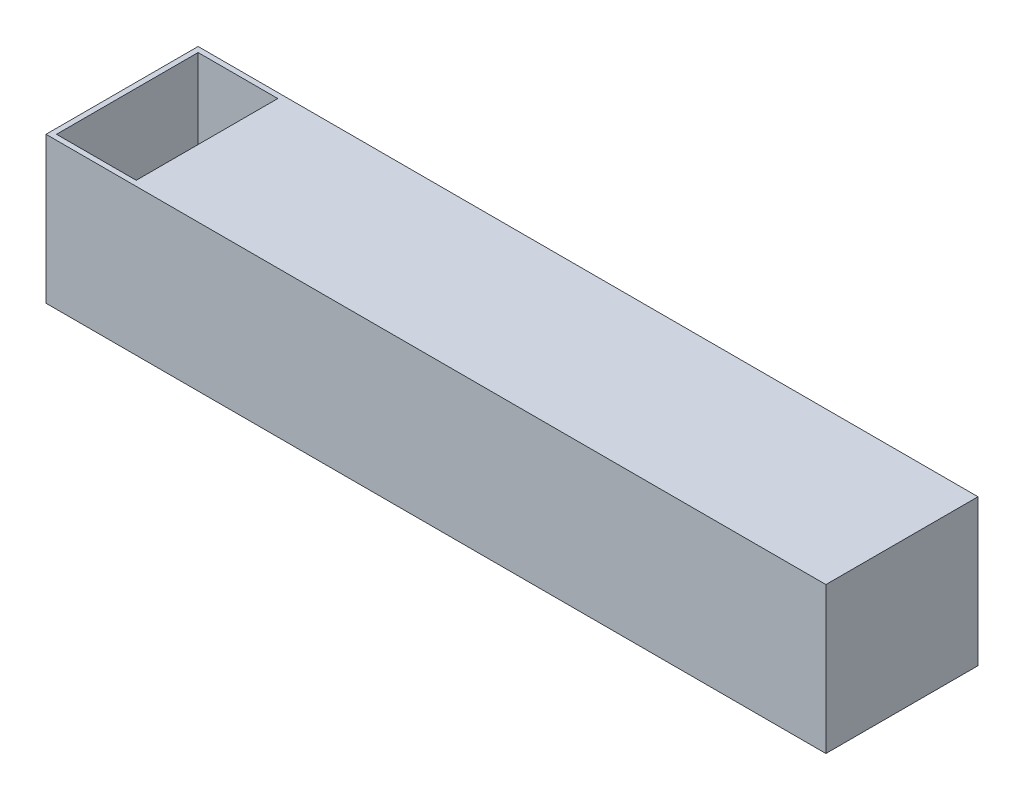
ISO-10303-21;
HEADER;
FILE_DESCRIPTION(('STEP AP214'),'2;1');
FILE_NAME('part.step','',(''),(''),'','','');
FILE_SCHEMA(('AUTOMOTIVE_DESIGN { 1 0 10303 214 1 1 1 1 }'));
ENDSEC;
DATA;
#1=APPLICATION_CONTEXT('core data for automotive mechanical design processes');
#2=APPLICATION_PROTOCOL_DEFINITION('international standard','automotive_design',2000,#1);
#3=PRODUCT_CONTEXT('',#1,'mechanical');
#4=PRODUCT('Part','Part','',(#3));
#5=PRODUCT_RELATED_PRODUCT_CATEGORY('part','',(#4));
#6=PRODUCT_DEFINITION_FORMATION('','',#4);
#7=PRODUCT_DEFINITION_CONTEXT('part definition',#1,'design');
#8=PRODUCT_DEFINITION('design','',#6,#7);
#9=PRODUCT_DEFINITION_SHAPE('','',#8);
#10=(LENGTH_UNIT() NAMED_UNIT(*) SI_UNIT(.MILLI.,.METRE.));
#11=(NAMED_UNIT(*) PLANE_ANGLE_UNIT() SI_UNIT($,.RADIAN.));
#12=(NAMED_UNIT(*) SI_UNIT($,.STERADIAN.) SOLID_ANGLE_UNIT());
#13=UNCERTAINTY_MEASURE_WITH_UNIT(LENGTH_MEASURE(1.E-05),#10,'distance_accuracy_value','');
#14=(GEOMETRIC_REPRESENTATION_CONTEXT(3) GLOBAL_UNCERTAINTY_ASSIGNED_CONTEXT((#13)) GLOBAL_UNIT_ASSIGNED_CONTEXT((#10,
#11,#12)) REPRESENTATION_CONTEXT('',''));
#15=CARTESIAN_POINT('',(0.,0.,0.));
#16=DIRECTION('',(0.,0.,1.));
#17=DIRECTION('',(1.,0.,0.));
#18=AXIS2_PLACEMENT_3D('',#15,#16,#17);
#19=CARTESIAN_POINT('',(10.7495076597565,122.86743477995,135.));
#20=DIRECTION('',(0.0871557427476583,0.996194698091746,0.));
#21=DIRECTION('',(-0.996194698091746,0.0871557427476583,0.));
#22=AXIS2_PLACEMENT_3D('',#19,#20,#21);
#23=PLANE('',#22);
#24=DIRECTION('',(0.996194698091746,-0.0871557427476583,0.));
#25=VECTOR('',#24,1.);
#26=CARTESIAN_POINT('',(10.7495076597565,122.86743477995,0.));
#27=LINE('',#26,#25);
#28=CARTESIAN_POINT('',(-31.5775573912309,126.570573132236,0.));
#29=VERTEX_POINT('',#28);
#30=CARTESIAN_POINT('',(625.910943349321,69.0477829187815,0.));
#31=VERTEX_POINT('',#30);
#32=EDGE_CURVE('E219',#29,#31,#27,.T.);
#33=ORIENTED_EDGE('',*,*,#32,.F.);
#34=DIRECTION('',(0.,0.,-1.));
#35=VECTOR('',#34,1.);
#36=CARTESIAN_POINT('',(-31.5775573912309,126.570573132236,135.));
#37=LINE('',#36,#35);
#38=CARTESIAN_POINT('',(-31.5775573912309,126.570573132236,135.));
#39=VERTEX_POINT('',#38);
#40=EDGE_CURVE('E256',#39,#29,#37,.T.);
#41=ORIENTED_EDGE('',*,*,#40,.F.);
#42=DIRECTION('',(0.996194698091746,-0.0871557427476583,0.));
#43=VECTOR('',#42,1.);
#44=CARTESIAN_POINT('',(10.7495076597565,122.86743477995,135.));
#45=LINE('',#44,#43);
#46=CARTESIAN_POINT('',(625.910943349321,69.0477829187815,135.));
#47=VERTEX_POINT('',#46);
#48=EDGE_CURVE('E225',#39,#47,#45,.T.);
#49=ORIENTED_EDGE('',*,*,#48,.T.);
#50=DIRECTION('',(0.,0.,-1.));
#51=VECTOR('',#50,1.);
#52=CARTESIAN_POINT('',(625.910943349321,69.0477829187815,135.));
#53=LINE('',#52,#51);
#54=EDGE_CURVE('E39',#47,#31,#53,.T.);
#55=ORIENTED_EDGE('',*,*,#54,.T.);
#56=EDGE_LOOP('',(#33,#41,#49,#55));
#57=FACE_BOUND('',#56,.T.);
#58=ADVANCED_FACE('F36',(#57),#23,.T.);
#59=CARTESIAN_POINT('',(-31.5775573912309,0.,135.));
#60=DIRECTION('',(1.,0.,0.));
#61=DIRECTION('',(0.,1.,0.));
#62=AXIS2_PLACEMENT_3D('',#59,#60,#61);
#63=PLANE('',#62);
#64=DIRECTION('',(0.,-1.,0.));
#65=VECTOR('',#64,1.);
#66=CARTESIAN_POINT('',(-31.5775573912309,0.,135.));
#67=LINE('',#66,#65);
#68=CARTESIAN_POINT('',(-31.5775573912309,205.570573132236,135.));
#69=VERTEX_POINT('',#68);
#70=EDGE_CURVE('E61',#69,#39,#67,.T.);
#71=ORIENTED_EDGE('',*,*,#70,.T.);
#72=ORIENTED_EDGE('',*,*,#40,.T.);
#73=DIRECTION('',(0.,-1.,0.));
#74=VECTOR('',#73,1.);
#75=CARTESIAN_POINT('',(-31.5775573912309,0.,0.));
#76=LINE('',#75,#74);
#77=CARTESIAN_POINT('',(-31.5775573912309,205.570573132236,0.));
#78=VERTEX_POINT('',#77);
#79=EDGE_CURVE('E239',#78,#29,#76,.T.);
#80=ORIENTED_EDGE('',*,*,#79,.F.);
#81=DIRECTION('',(0.,0.,1.));
#82=VECTOR('',#81,1.);
#83=CARTESIAN_POINT('',(-31.5775573912309,205.570573132236,0.));
#84=LINE('',#83,#82);
#85=EDGE_CURVE('E177',#78,#69,#84,.T.);
#86=ORIENTED_EDGE('',*,*,#85,.T.);
#87=EDGE_LOOP('',(#71,#72,#80,#86));
#88=FACE_BOUND('',#87,.T.);
#89=ADVANCED_FACE('F279',(#88),#63,.T.);
#90=CARTESIAN_POINT('',(0.,202.570573132236,135.));
#91=DIRECTION('',(0.,1.,0.));
#92=DIRECTION('',(-1.,0.,0.));
#93=AXIS2_PLACEMENT_3D('',#90,#91,#92);
#94=PLANE('',#93);
#95=DIRECTION('',(1.,0.,0.));
#96=VECTOR('',#95,1.);
#97=CARTESIAN_POINT('',(0.,202.570573132236,135.));
#98=LINE('',#97,#96);
#99=CARTESIAN_POINT('',(44.4224426087691,202.570573132236,135.));
#100=VERTEX_POINT('',#99);
#101=CARTESIAN_POINT('',(701.910943349321,202.570573132236,135.));
#102=VERTEX_POINT('',#101);
#103=EDGE_CURVE('E230',#100,#102,#98,.T.);
#104=ORIENTED_EDGE('',*,*,#103,.F.);
#105=DIRECTION('',(0.,0.,-1.));
#106=VECTOR('',#105,1.);
#107=CARTESIAN_POINT('',(44.4224426087691,202.570573132236,135.));
#108=LINE('',#107,#106);
#109=CARTESIAN_POINT('',(44.4224426087691,202.570573132236,0.));
#110=VERTEX_POINT('',#109);
#111=EDGE_CURVE('E191',#100,#110,#108,.T.);
#112=ORIENTED_EDGE('',*,*,#111,.T.);
#113=DIRECTION('',(1.,0.,0.));
#114=VECTOR('',#113,1.);
#115=CARTESIAN_POINT('',(0.,202.570573132236,0.));
#116=LINE('',#115,#114);
#117=CARTESIAN_POINT('',(701.910943349321,202.570573132236,0.));
#118=VERTEX_POINT('',#117);
#119=EDGE_CURVE('E158',#110,#118,#116,.T.);
#120=ORIENTED_EDGE('',*,*,#119,.T.);
#121=DIRECTION('',(0.,0.,-1.));
#122=VECTOR('',#121,1.);
#123=CARTESIAN_POINT('',(701.910943349321,202.570573132236,135.));
#124=LINE('',#123,#122);
#125=EDGE_CURVE('E154',#102,#118,#124,.T.);
#126=ORIENTED_EDGE('',*,*,#125,.F.);
#127=EDGE_LOOP('',(#104,#112,#120,#126));
#128=FACE_BOUND('',#127,.T.);
#129=ADVANCED_FACE('F269',(#128),#94,.F.);
#130=CARTESIAN_POINT('',(701.910943349321,0.,135.));
#131=DIRECTION('',(1.,0.,0.));
#132=DIRECTION('',(0.,0.,-1.));
#133=AXIS2_PLACEMENT_3D('',#130,#131,#132);
#134=PLANE('',#133);
#135=DIRECTION('',(0.,0.,1.));
#136=VECTOR('',#135,1.);
#137=CARTESIAN_POINT('',(701.910943349321,66.0477829187815,135.));
#138=LINE('',#137,#136);
#139=CARTESIAN_POINT('',(701.910943349321,66.0477829187815,0.));
#140=VERTEX_POINT('',#139);
#141=CARTESIAN_POINT('',(701.910943349321,66.0477829187815,135.));
#142=VERTEX_POINT('',#141);
#143=EDGE_CURVE('E151',#140,#142,#138,.T.);
#144=ORIENTED_EDGE('',*,*,#143,.T.);
#145=DIRECTION('',(0.,-1.,0.));
#146=VECTOR('',#145,1.);
#147=CARTESIAN_POINT('',(701.910943349321,0.,135.));
#148=LINE('',#147,#146);
#149=EDGE_CURVE('E232',#102,#142,#148,.T.);
#150=ORIENTED_EDGE('',*,*,#149,.F.);
#151=ORIENTED_EDGE('',*,*,#125,.T.);
#152=DIRECTION('',(0.,-1.,0.));
#153=VECTOR('',#152,1.);
#154=CARTESIAN_POINT('',(701.910943349321,0.,0.));
#155=LINE('',#154,#153);
#156=EDGE_CURVE('E146',#118,#140,#155,.T.);
#157=ORIENTED_EDGE('',*,*,#156,.T.);
#158=EDGE_LOOP('',(#144,#150,#151,#157));
#159=FACE_BOUND('',#158,.T.);
#160=ADVANCED_FACE('F148',(#159),#134,.F.);
#161=CARTESIAN_POINT('',(0.,0.,0.));
#162=DIRECTION('',(0.,0.,1.));
#163=DIRECTION('',(1.,0.,0.));
#164=AXIS2_PLACEMENT_3D('',#161,#162,#163);
#165=PLANE('',#164);
#166=ORIENTED_EDGE('',*,*,#32,.T.);
#167=DIRECTION('',(0.,-1.,0.));
#168=VECTOR('',#167,1.);
#169=CARTESIAN_POINT('',(625.910943349321,76.0477829187815,0.));
#170=LINE('',#169,#168);
#171=CARTESIAN_POINT('',(625.910943349321,66.0477829187815,0.));
#172=VERTEX_POINT('',#171);
#173=EDGE_CURVE('E164',#31,#172,#170,.T.);
#174=ORIENTED_EDGE('',*,*,#173,.T.);
#175=DIRECTION('',(1.,0.,0.));
#176=VECTOR('',#175,1.);
#177=CARTESIAN_POINT('',(625.910943349321,66.0477829187815,0.));
#178=LINE('',#177,#176);
#179=EDGE_CURVE('E161',#172,#140,#178,.T.);
#180=ORIENTED_EDGE('',*,*,#179,.T.);
#181=ORIENTED_EDGE('',*,*,#156,.F.);
#182=ORIENTED_EDGE('',*,*,#119,.F.);
#183=DIRECTION('',(0.,1.,0.));
#184=VECTOR('',#183,1.);
#185=CARTESIAN_POINT('',(44.4224426087691,195.570573132236,0.));
#186=LINE('',#185,#184);
#187=CARTESIAN_POINT('',(44.4224426087691,205.570573132236,0.));
#188=VERTEX_POINT('',#187);
#189=EDGE_CURVE('E189',#110,#188,#186,.T.);
#190=ORIENTED_EDGE('',*,*,#189,.T.);
#191=DIRECTION('',(-1.,0.,0.));
#192=VECTOR('',#191,1.);
#193=CARTESIAN_POINT('',(-31.5775573912309,205.570573132236,0.));
#194=LINE('',#193,#192);
#195=EDGE_CURVE('E185',#188,#78,#194,.T.);
#196=ORIENTED_EDGE('',*,*,#195,.T.);
#197=ORIENTED_EDGE('',*,*,#79,.T.);
#198=EDGE_LOOP('',(#166,#174,#180,#181,#182,#190,#196,#197));
#199=FACE_BOUND('',#198,.T.);
#200=ADVANCED_FACE('F163',(#199),#165,.T.);
#201=CARTESIAN_POINT('',(0.,0.,135.));
#202=DIRECTION('',(0.,0.,1.));
#203=DIRECTION('',(1.,0.,0.));
#204=AXIS2_PLACEMENT_3D('',#201,#202,#203);
#205=PLANE('',#204);
#206=ORIENTED_EDGE('',*,*,#149,.T.);
#207=DIRECTION('',(-1.,0.,0.));
#208=VECTOR('',#207,1.);
#209=CARTESIAN_POINT('',(625.910943349321,66.0477829187815,135.));
#210=LINE('',#209,#208);
#211=CARTESIAN_POINT('',(625.910943349321,66.0477829187815,135.));
#212=VERTEX_POINT('',#211);
#213=EDGE_CURVE('E170',#142,#212,#210,.T.);
#214=ORIENTED_EDGE('',*,*,#213,.T.);
#215=DIRECTION('',(0.,-1.,0.));
#216=VECTOR('',#215,1.);
#217=CARTESIAN_POINT('',(625.910943349321,76.0477829187815,135.));
#218=LINE('',#217,#216);
#219=EDGE_CURVE('E175',#47,#212,#218,.T.);
#220=ORIENTED_EDGE('',*,*,#219,.F.);
#221=ORIENTED_EDGE('',*,*,#48,.F.);
#222=ORIENTED_EDGE('',*,*,#70,.F.);
#223=DIRECTION('',(1.,0.,0.));
#224=VECTOR('',#223,1.);
#225=CARTESIAN_POINT('',(-31.5775573912309,205.570573132236,135.));
#226=LINE('',#225,#224);
#227=CARTESIAN_POINT('',(44.4224426087691,205.570573132236,135.));
#228=VERTEX_POINT('',#227);
#229=EDGE_CURVE('E180',#69,#228,#226,.T.);
#230=ORIENTED_EDGE('',*,*,#229,.T.);
#231=DIRECTION('',(0.,1.,0.));
#232=VECTOR('',#231,1.);
#233=CARTESIAN_POINT('',(44.4224426087691,195.570573132236,135.));
#234=LINE('',#233,#232);
#235=EDGE_CURVE('E188',#100,#228,#234,.T.);
#236=ORIENTED_EDGE('',*,*,#235,.F.);
#237=ORIENTED_EDGE('',*,*,#103,.T.);
#238=EDGE_LOOP('',(#206,#214,#220,#221,#222,#230,#236,#237));
#239=FACE_BOUND('',#238,.T.);
#240=ADVANCED_FACE('F265',(#239),#205,.F.);
#241=CARTESIAN_POINT('',(44.4224426087691,195.570573132236,0.));
#242=DIRECTION('',(1.,0.,0.));
#243=DIRECTION('',(0.,0.,-1.));
#244=AXIS2_PLACEMENT_3D('',#241,#242,#243);
#245=PLANE('',#244);
#246=ORIENTED_EDGE('',*,*,#235,.T.);
#247=DIRECTION('',(0.,0.,-1.));
#248=VECTOR('',#247,1.);
#249=CARTESIAN_POINT('',(44.4224426087691,205.570573132236,0.));
#250=LINE('',#249,#248);
#251=EDGE_CURVE('E182',#228,#188,#250,.T.);
#252=ORIENTED_EDGE('',*,*,#251,.T.);
#253=ORIENTED_EDGE('',*,*,#189,.F.);
#254=ORIENTED_EDGE('',*,*,#111,.F.);
#255=EDGE_LOOP('',(#246,#252,#253,#254));
#256=FACE_BOUND('',#255,.T.);
#257=ADVANCED_FACE('F274',(#256),#245,.F.);
#258=CARTESIAN_POINT('',(0.,0.,140.));
#259=DIRECTION('',(0.,0.,1.));
#260=DIRECTION('',(1.,0.,0.));
#261=AXIS2_PLACEMENT_3D('',#258,#259,#260);
#262=PLANE('',#261);
#263=DIRECTION('',(0.,-1.,0.));
#264=VECTOR('',#263,1.);
#265=CARTESIAN_POINT('',(-36.5775573912309,205.570573132236,140.));
#266=LINE('',#265,#264);
#267=CARTESIAN_POINT('',(-36.5775573912309,205.570573132236,140.));
#268=VERTEX_POINT('',#267);
#269=CARTESIAN_POINT('',(-36.5775573912309,66.0477829187815,140.));
#270=VERTEX_POINT('',#269);
#271=EDGE_CURVE('E195',#268,#270,#266,.T.);
#272=ORIENTED_EDGE('',*,*,#271,.T.);
#273=DIRECTION('',(1.,0.,0.));
#274=VECTOR('',#273,1.);
#275=CARTESIAN_POINT('',(-36.5775573912309,66.0477829187815,140.));
#276=LINE('',#275,#274);
#277=CARTESIAN_POINT('',(706.910943349321,66.0477829187815,140.));
#278=VERTEX_POINT('',#277);
#279=EDGE_CURVE('E198',#270,#278,#276,.T.);
#280=ORIENTED_EDGE('',*,*,#279,.T.);
#281=DIRECTION('',(0.,1.,0.));
#282=VECTOR('',#281,1.);
#283=CARTESIAN_POINT('',(706.910943349321,205.570573132236,140.));
#284=LINE('',#283,#282);
#285=CARTESIAN_POINT('',(706.910943349321,205.570573132236,140.));
#286=VERTEX_POINT('',#285);
#287=EDGE_CURVE('E201',#278,#286,#284,.T.);
#288=ORIENTED_EDGE('',*,*,#287,.T.);
#289=DIRECTION('',(-1.,0.,0.));
#290=VECTOR('',#289,1.);
#291=CARTESIAN_POINT('',(-36.5775573912309,205.570573132236,140.));
#292=LINE('',#291,#290);
#293=EDGE_CURVE('E204',#286,#268,#292,.T.);
#294=ORIENTED_EDGE('',*,*,#293,.T.);
#295=EDGE_LOOP('',(#272,#280,#288,#294));
#296=FACE_BOUND('',#295,.T.);
#297=ADVANCED_FACE('F325',(#296),#262,.T.);
#298=CARTESIAN_POINT('',(0.,0.,-5.));
#299=DIRECTION('',(0.,0.,1.));
#300=DIRECTION('',(1.,0.,0.));
#301=AXIS2_PLACEMENT_3D('',#298,#299,#300);
#302=PLANE('',#301);
#303=DIRECTION('',(0.,-1.,0.));
#304=VECTOR('',#303,1.);
#305=CARTESIAN_POINT('',(706.910943349321,0.,-5.));
#306=LINE('',#305,#304);
#307=CARTESIAN_POINT('',(706.910943349321,205.570573132236,-5.));
#308=VERTEX_POINT('',#307);
#309=CARTESIAN_POINT('',(706.910943349321,66.0477829187815,-5.));
#310=VERTEX_POINT('',#309);
#311=EDGE_CURVE('E207',#308,#310,#306,.T.);
#312=ORIENTED_EDGE('',*,*,#311,.T.);
#313=DIRECTION('',(1.,0.,0.));
#314=VECTOR('',#313,1.);
#315=CARTESIAN_POINT('',(0.,66.0477829187815,-5.));
#316=LINE('',#315,#314);
#317=CARTESIAN_POINT('',(-36.5775573912309,66.0477829187815,-5.));
#318=VERTEX_POINT('',#317);
#319=EDGE_CURVE('E216',#318,#310,#316,.T.);
#320=ORIENTED_EDGE('',*,*,#319,.F.);
#321=DIRECTION('',(0.,-1.,0.));
#322=VECTOR('',#321,1.);
#323=CARTESIAN_POINT('',(-36.5775573912309,0.,-5.));
#324=LINE('',#323,#322);
#325=CARTESIAN_POINT('',(-36.5775573912309,205.570573132236,-5.));
#326=VERTEX_POINT('',#325);
#327=EDGE_CURVE('E213',#326,#318,#324,.T.);
#328=ORIENTED_EDGE('',*,*,#327,.F.);
#329=DIRECTION('',(1.,0.,0.));
#330=VECTOR('',#329,1.);
#331=CARTESIAN_POINT('',(0.,205.570573132236,-5.));
#332=LINE('',#331,#330);
#333=EDGE_CURVE('E210',#326,#308,#332,.T.);
#334=ORIENTED_EDGE('',*,*,#333,.T.);
#335=EDGE_LOOP('',(#312,#320,#328,#334));
#336=FACE_BOUND('',#335,.T.);
#337=ADVANCED_FACE('F331',(#336),#302,.F.);
#338=CARTESIAN_POINT('',(0.,205.570573132236,135.));
#339=DIRECTION('',(0.,1.,0.));
#340=DIRECTION('',(0.,0.,1.));
#341=AXIS2_PLACEMENT_3D('',#338,#339,#340);
#342=PLANE('',#341);
#343=ORIENTED_EDGE('',*,*,#85,.F.);
#344=ORIENTED_EDGE('',*,*,#195,.F.);
#345=ORIENTED_EDGE('',*,*,#251,.F.);
#346=ORIENTED_EDGE('',*,*,#229,.F.);
#347=EDGE_LOOP('',(#343,#344,#345,#346));
#348=FACE_BOUND('',#347,.T.);
#349=DIRECTION('',(0.,0.,-1.));
#350=VECTOR('',#349,1.);
#351=CARTESIAN_POINT('',(706.910943349321,205.570573132236,135.));
#352=LINE('',#351,#350);
#353=EDGE_CURVE('E246',#286,#308,#352,.T.);
#354=ORIENTED_EDGE('',*,*,#353,.T.);
#355=ORIENTED_EDGE('',*,*,#333,.F.);
#356=DIRECTION('',(0.,0.,-1.));
#357=VECTOR('',#356,1.);
#358=CARTESIAN_POINT('',(-36.5775573912309,205.570573132236,135.));
#359=LINE('',#358,#357);
#360=EDGE_CURVE('E253',#268,#326,#359,.T.);
#361=ORIENTED_EDGE('',*,*,#360,.F.);
#362=ORIENTED_EDGE('',*,*,#293,.F.);
#363=EDGE_LOOP('',(#354,#355,#361,#362));
#364=FACE_BOUND('',#363,.T.);
#365=ADVANCED_FACE('F277',(#348,#364),#342,.T.);
#366=CARTESIAN_POINT('',(706.910943349321,0.,135.));
#367=DIRECTION('',(1.,0.,0.));
#368=DIRECTION('',(0.,0.,-1.));
#369=AXIS2_PLACEMENT_3D('',#366,#367,#368);
#370=PLANE('',#369);
#371=DIRECTION('',(0.,0.,-1.));
#372=VECTOR('',#371,1.);
#373=CARTESIAN_POINT('',(706.910943349321,66.0477829187815,135.));
#374=LINE('',#373,#372);
#375=EDGE_CURVE('E249',#278,#310,#374,.T.);
#376=ORIENTED_EDGE('',*,*,#375,.T.);
#377=ORIENTED_EDGE('',*,*,#311,.F.);
#378=ORIENTED_EDGE('',*,*,#353,.F.);
#379=ORIENTED_EDGE('',*,*,#287,.F.);
#380=EDGE_LOOP('',(#376,#377,#378,#379));
#381=FACE_BOUND('',#380,.T.);
#382=ADVANCED_FACE('F338',(#381),#370,.T.);
#383=CARTESIAN_POINT('',(0.,66.0477829187815,135.));
#384=DIRECTION('',(0.,1.,0.));
#385=DIRECTION('',(0.,0.,1.));
#386=AXIS2_PLACEMENT_3D('',#383,#384,#385);
#387=PLANE('',#386);
#388=ORIENTED_EDGE('',*,*,#179,.F.);
#389=DIRECTION('',(0.,0.,-1.));
#390=VECTOR('',#389,1.);
#391=CARTESIAN_POINT('',(625.910943349321,66.0477829187815,135.));
#392=LINE('',#391,#390);
#393=EDGE_CURVE('E53',#212,#172,#392,.T.);
#394=ORIENTED_EDGE('',*,*,#393,.F.);
#395=ORIENTED_EDGE('',*,*,#213,.F.);
#396=ORIENTED_EDGE('',*,*,#143,.F.);
#397=EDGE_LOOP('',(#388,#394,#395,#396));
#398=FACE_BOUND('',#397,.T.);
#399=DIRECTION('',(0.,0.,-1.));
#400=VECTOR('',#399,1.);
#401=CARTESIAN_POINT('',(-36.5775573912309,66.0477829187815,135.));
#402=LINE('',#401,#400);
#403=EDGE_CURVE('E251',#270,#318,#402,.T.);
#404=ORIENTED_EDGE('',*,*,#403,.T.);
#405=ORIENTED_EDGE('',*,*,#319,.T.);
#406=ORIENTED_EDGE('',*,*,#375,.F.);
#407=ORIENTED_EDGE('',*,*,#279,.F.);
#408=EDGE_LOOP('',(#404,#405,#406,#407));
#409=FACE_BOUND('',#408,.T.);
#410=ADVANCED_FACE('F167',(#398,#409),#387,.F.);
#411=CARTESIAN_POINT('',(-36.5775573912309,0.,135.));
#412=DIRECTION('',(1.,0.,0.));
#413=DIRECTION('',(0.,1.,0.));
#414=AXIS2_PLACEMENT_3D('',#411,#412,#413);
#415=PLANE('',#414);
#416=ORIENTED_EDGE('',*,*,#360,.T.);
#417=ORIENTED_EDGE('',*,*,#327,.T.);
#418=ORIENTED_EDGE('',*,*,#403,.F.);
#419=ORIENTED_EDGE('',*,*,#271,.F.);
#420=EDGE_LOOP('',(#416,#417,#418,#419));
#421=FACE_BOUND('',#420,.T.);
#422=ADVANCED_FACE('F349',(#421),#415,.F.);
#423=CARTESIAN_POINT('',(625.910943349321,76.0477829187815,135.));
#424=DIRECTION('',(-1.,0.,0.));
#425=DIRECTION('',(0.,0.,1.));
#426=AXIS2_PLACEMENT_3D('',#423,#424,#425);
#427=PLANE('',#426);
#428=ORIENTED_EDGE('',*,*,#54,.F.);
#429=ORIENTED_EDGE('',*,*,#219,.T.);
#430=ORIENTED_EDGE('',*,*,#393,.T.);
#431=ORIENTED_EDGE('',*,*,#173,.F.);
#432=EDGE_LOOP('',(#428,#429,#430,#431));
#433=FACE_BOUND('',#432,.T.);
#434=ADVANCED_FACE('F264',(#433),#427,.F.);
#435=CLOSED_SHELL('',(#58,#89,#129,#160,#200,#240,#257,#297,#337,#365,#382,#410,#422,#434));
#436=DIRECTION('',(0.996194698091746,-0.0871557427476584,0.));
#437=VECTOR('',#436,1.);
#438=CARTESIAN_POINT('',(10.3137289460182,117.886461289492,0.));
#439=LINE('',#438,#437);
#440=CARTESIAN_POINT('',(-31.5775573912309,121.551473944519,0.));
#441=VERTEX_POINT('',#440);
#442=CARTESIAN_POINT('',(568.542377120972,69.0477829187815,0.));
#443=VERTEX_POINT('',#442);
#444=EDGE_CURVE('E157',#441,#443,#439,.T.);
#445=ORIENTED_EDGE('',*,*,#444,.F.);
#446=CARTESIAN_POINT('',(-31.5775573912309,69.0477829187815,0.));
#447=VERTEX_POINT('',#446);
#448=EDGE_CURVE('E228',#441,#447,#76,.T.);
#449=ORIENTED_EDGE('',*,*,#448,.T.);
#450=DIRECTION('',(1.,0.,0.));
#451=VECTOR('',#450,1.);
#452=CARTESIAN_POINT('',(0.,69.0477829187815,0.));
#453=LINE('',#452,#451);
#454=EDGE_CURVE('E235',#447,#443,#453,.T.);
#455=ORIENTED_EDGE('',*,*,#454,.T.);
#456=EDGE_LOOP('',(#445,#449,#455));
#457=FACE_BOUND('',#456,.T.);
#458=ADVANCED_FACE('F291',(#457),#165,.T.);
#459=ORIENTED_EDGE('',*,*,#448,.F.);
#460=DIRECTION('',(0.,0.,-1.));
#461=VECTOR('',#460,1.);
#462=CARTESIAN_POINT('',(-31.5775573912309,121.551473944519,135.));
#463=LINE('',#462,#461);
#464=CARTESIAN_POINT('',(-31.5775573912309,121.551473944519,135.));
#465=VERTEX_POINT('',#464);
#466=EDGE_CURVE('E244',#465,#441,#463,.T.);
#467=ORIENTED_EDGE('',*,*,#466,.F.);
#468=CARTESIAN_POINT('',(-31.5775573912309,69.0477829187815,135.));
#469=VERTEX_POINT('',#468);
#470=EDGE_CURVE('E223',#465,#469,#67,.T.);
#471=ORIENTED_EDGE('',*,*,#470,.T.);
#472=DIRECTION('',(0.,0.,-1.));
#473=VECTOR('',#472,1.);
#474=CARTESIAN_POINT('',(-31.5775573912309,69.0477829187815,135.));
#475=LINE('',#474,#473);
#476=EDGE_CURVE('E45',#469,#447,#475,.T.);
#477=ORIENTED_EDGE('',*,*,#476,.T.);
#478=EDGE_LOOP('',(#459,#467,#471,#477));
#479=FACE_BOUND('',#478,.T.);
#480=ADVANCED_FACE('F282',(#479),#63,.T.);
#481=CARTESIAN_POINT('',(0.,69.0477829187815,135.));
#482=DIRECTION('',(0.,1.,0.));
#483=DIRECTION('',(0.,0.,1.));
#484=AXIS2_PLACEMENT_3D('',#481,#482,#483);
#485=PLANE('',#484);
#486=ORIENTED_EDGE('',*,*,#454,.F.);
#487=ORIENTED_EDGE('',*,*,#476,.F.);
#488=DIRECTION('',(1.,0.,0.));
#489=VECTOR('',#488,1.);
#490=CARTESIAN_POINT('',(0.,69.0477829187815,135.));
#491=LINE('',#490,#489);
#492=CARTESIAN_POINT('',(568.542377120972,69.0477829187815,135.));
#493=VERTEX_POINT('',#492);
#494=EDGE_CURVE('E220',#469,#493,#491,.T.);
#495=ORIENTED_EDGE('',*,*,#494,.T.);
#496=DIRECTION('',(0.,0.,-1.));
#497=VECTOR('',#496,1.);
#498=CARTESIAN_POINT('',(568.542377120972,69.0477829187815,135.));
#499=LINE('',#498,#497);
#500=EDGE_CURVE('E11',#493,#443,#499,.T.);
#501=ORIENTED_EDGE('',*,*,#500,.T.);
#502=EDGE_LOOP('',(#486,#487,#495,#501));
#503=FACE_BOUND('',#502,.T.);
#504=ADVANCED_FACE('F290',(#503),#485,.T.);
#505=CARTESIAN_POINT('',(10.3137289460182,117.886461289492,135.));
#506=DIRECTION('',(0.0871557427476584,0.996194698091746,0.));
#507=DIRECTION('',(-0.996194698091746,0.0871557427476584,0.));
#508=AXIS2_PLACEMENT_3D('',#505,#506,#507);
#509=PLANE('',#508);
#510=ORIENTED_EDGE('',*,*,#444,.T.);
#511=ORIENTED_EDGE('',*,*,#500,.F.);
#512=DIRECTION('',(0.996194698091746,-0.0871557427476584,0.));
#513=VECTOR('',#512,1.);
#514=CARTESIAN_POINT('',(10.3137289460182,117.886461289492,135.));
#515=LINE('',#514,#513);
#516=EDGE_CURVE('E224',#465,#493,#515,.T.);
#517=ORIENTED_EDGE('',*,*,#516,.F.);
#518=ORIENTED_EDGE('',*,*,#466,.T.);
#519=EDGE_LOOP('',(#510,#511,#517,#518));
#520=FACE_BOUND('',#519,.T.);
#521=ADVANCED_FACE('F298',(#520),#509,.F.);
#522=ORIENTED_EDGE('',*,*,#470,.F.);
#523=ORIENTED_EDGE('',*,*,#516,.T.);
#524=ORIENTED_EDGE('',*,*,#494,.F.);
#525=EDGE_LOOP('',(#522,#523,#524));
#526=FACE_BOUND('',#525,.T.);
#527=ADVANCED_FACE('F311',(#526),#205,.F.);
#528=CLOSED_SHELL('',(#458,#480,#504,#521,#527));
#529=ORIENTED_CLOSED_SHELL('',*,#528,.T.);
#530=BREP_WITH_VOIDS('B2',#435,(#529));
#531=ADVANCED_BREP_SHAPE_REPRESENTATION('',(#18,#530),#14);
#532=SHAPE_DEFINITION_REPRESENTATION(#9,#531);
ENDSEC;
END-ISO-10303-21;
